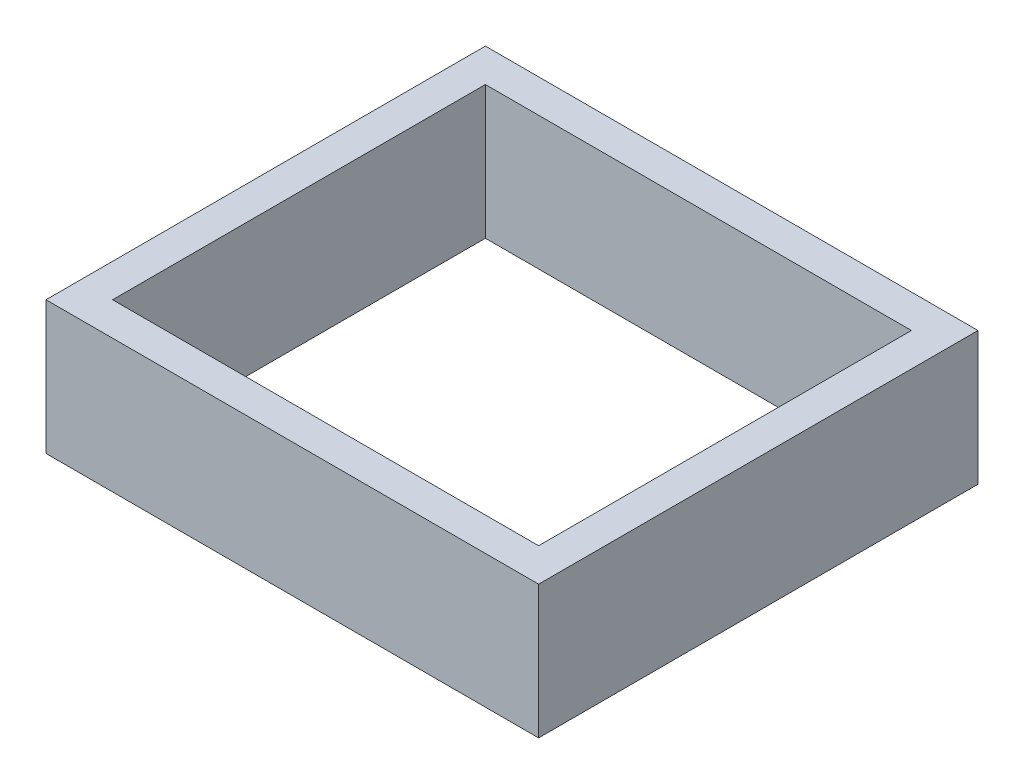
ISO-10303-21;
HEADER;
FILE_DESCRIPTION(('STEP AP214'),'2;1');
FILE_NAME('part.step','',(''),(''),'','','');
FILE_SCHEMA(('AUTOMOTIVE_DESIGN { 1 0 10303 214 1 1 1 1 }'));
ENDSEC;
DATA;
#1=APPLICATION_CONTEXT('core data for automotive mechanical design processes');
#2=APPLICATION_PROTOCOL_DEFINITION('international standard','automotive_design',2000,#1);
#3=PRODUCT_CONTEXT('',#1,'mechanical');
#4=PRODUCT('Part','Part','',(#3));
#5=PRODUCT_RELATED_PRODUCT_CATEGORY('part','',(#4));
#6=PRODUCT_DEFINITION_FORMATION('','',#4);
#7=PRODUCT_DEFINITION_CONTEXT('part definition',#1,'design');
#8=PRODUCT_DEFINITION('design','',#6,#7);
#9=PRODUCT_DEFINITION_SHAPE('','',#8);
#10=(LENGTH_UNIT() NAMED_UNIT(*) SI_UNIT(.MILLI.,.METRE.));
#11=(NAMED_UNIT(*) PLANE_ANGLE_UNIT() SI_UNIT($,.RADIAN.));
#12=(NAMED_UNIT(*) SI_UNIT($,.STERADIAN.) SOLID_ANGLE_UNIT());
#13=UNCERTAINTY_MEASURE_WITH_UNIT(LENGTH_MEASURE(1.E-05),#10,'distance_accuracy_value','');
#14=(GEOMETRIC_REPRESENTATION_CONTEXT(3) GLOBAL_UNCERTAINTY_ASSIGNED_CONTEXT((#13)) GLOBAL_UNIT_ASSIGNED_CONTEXT((#10,
#11,#12)) REPRESENTATION_CONTEXT('',''));
#15=CARTESIAN_POINT('',(0.,0.,0.));
#16=DIRECTION('',(0.,0.,1.));
#17=DIRECTION('',(1.,0.,0.));
#18=AXIS2_PLACEMENT_3D('',#15,#16,#17);
#19=CARTESIAN_POINT('',(0.,20.,0.));
#20=DIRECTION('',(0.,-1.,0.));
#21=DIRECTION('',(0.,0.,-1.));
#22=AXIS2_PLACEMENT_3D('',#19,#20,#21);
#23=PLANE('',#22);
#24=DIRECTION('',(0.,0.,1.));
#25=VECTOR('',#24,1.);
#26=CARTESIAN_POINT('',(0.,20.,0.));
#27=LINE('',#26,#25);
#28=CARTESIAN_POINT('',(0.,20.,-66.));
#29=VERTEX_POINT('',#28);
#30=CARTESIAN_POINT('',(0.,20.,0.));
#31=VERTEX_POINT('',#30);
#32=EDGE_CURVE('E134',#29,#31,#27,.T.);
#33=ORIENTED_EDGE('',*,*,#32,.T.);
#34=DIRECTION('',(1.,0.,0.));
#35=VECTOR('',#34,1.);
#36=CARTESIAN_POINT('',(0.,20.,0.));
#37=LINE('',#36,#35);
#38=CARTESIAN_POINT('',(74.,20.,0.));
#39=VERTEX_POINT('',#38);
#40=EDGE_CURVE('E137',#31,#39,#37,.T.);
#41=ORIENTED_EDGE('',*,*,#40,.T.);
#42=DIRECTION('',(0.,0.,-1.));
#43=VECTOR('',#42,1.);
#44=CARTESIAN_POINT('',(74.,20.,0.));
#45=LINE('',#44,#43);
#46=CARTESIAN_POINT('',(74.,20.,-66.));
#47=VERTEX_POINT('',#46);
#48=EDGE_CURVE('E140',#39,#47,#45,.T.);
#49=ORIENTED_EDGE('',*,*,#48,.T.);
#50=DIRECTION('',(-1.,0.,0.));
#51=VECTOR('',#50,1.);
#52=CARTESIAN_POINT('',(0.,20.,-66.));
#53=LINE('',#52,#51);
#54=EDGE_CURVE('E142',#47,#29,#53,.T.);
#55=ORIENTED_EDGE('',*,*,#54,.T.);
#56=EDGE_LOOP('',(#33,#41,#49,#55));
#57=FACE_BOUND('',#56,.T.);
#58=DIRECTION('',(0.,0.,1.));
#59=VECTOR('',#58,1.);
#60=CARTESIAN_POINT('',(5.,20.,-5.));
#61=LINE('',#60,#59);
#62=CARTESIAN_POINT('',(5.,20.,-61.));
#63=VERTEX_POINT('',#62);
#64=CARTESIAN_POINT('',(5.,20.,-5.));
#65=VERTEX_POINT('',#64);
#66=EDGE_CURVE('E98',#63,#65,#61,.T.);
#67=ORIENTED_EDGE('',*,*,#66,.F.);
#68=DIRECTION('',(-1.,0.,0.));
#69=VECTOR('',#68,1.);
#70=CARTESIAN_POINT('',(5.,20.,-61.));
#71=LINE('',#70,#69);
#72=CARTESIAN_POINT('',(69.,20.,-61.));
#73=VERTEX_POINT('',#72);
#74=EDGE_CURVE('E120',#73,#63,#71,.T.);
#75=ORIENTED_EDGE('',*,*,#74,.F.);
#76=DIRECTION('',(0.,0.,-1.));
#77=VECTOR('',#76,1.);
#78=CARTESIAN_POINT('',(69.,20.,-5.));
#79=LINE('',#78,#77);
#80=CARTESIAN_POINT('',(69.,20.,-5.));
#81=VERTEX_POINT('',#80);
#82=EDGE_CURVE('E118',#81,#73,#79,.T.);
#83=ORIENTED_EDGE('',*,*,#82,.F.);
#84=DIRECTION('',(1.,0.,0.));
#85=VECTOR('',#84,1.);
#86=CARTESIAN_POINT('',(5.,20.,-5.));
#87=LINE('',#86,#85);
#88=EDGE_CURVE('E106',#65,#81,#87,.T.);
#89=ORIENTED_EDGE('',*,*,#88,.F.);
#90=EDGE_LOOP('',(#67,#75,#83,#89));
#91=FACE_BOUND('',#90,.T.);
#92=ADVANCED_FACE('F33',(#57,#91),#23,.F.);
#93=CARTESIAN_POINT('',(0.,0.,0.));
#94=DIRECTION('',(0.,-1.,0.));
#95=DIRECTION('',(0.,0.,-1.));
#96=AXIS2_PLACEMENT_3D('',#93,#94,#95);
#97=PLANE('',#96);
#98=DIRECTION('',(0.,0.,1.));
#99=VECTOR('',#98,1.);
#100=CARTESIAN_POINT('',(0.,0.,0.));
#101=LINE('',#100,#99);
#102=CARTESIAN_POINT('',(0.,0.,-66.));
#103=VERTEX_POINT('',#102);
#104=CARTESIAN_POINT('',(0.,0.,0.));
#105=VERTEX_POINT('',#104);
#106=EDGE_CURVE('E114',#103,#105,#101,.T.);
#107=ORIENTED_EDGE('',*,*,#106,.F.);
#108=DIRECTION('',(-1.,0.,0.));
#109=VECTOR('',#108,1.);
#110=CARTESIAN_POINT('',(0.,0.,-66.));
#111=LINE('',#110,#109);
#112=CARTESIAN_POINT('',(74.,0.,-66.));
#113=VERTEX_POINT('',#112);
#114=EDGE_CURVE('E138',#113,#103,#111,.T.);
#115=ORIENTED_EDGE('',*,*,#114,.F.);
#116=DIRECTION('',(0.,0.,-1.));
#117=VECTOR('',#116,1.);
#118=CARTESIAN_POINT('',(74.,0.,0.));
#119=LINE('',#118,#117);
#120=CARTESIAN_POINT('',(74.,0.,0.));
#121=VERTEX_POINT('',#120);
#122=EDGE_CURVE('E149',#121,#113,#119,.T.);
#123=ORIENTED_EDGE('',*,*,#122,.F.);
#124=DIRECTION('',(1.,0.,0.));
#125=VECTOR('',#124,1.);
#126=CARTESIAN_POINT('',(0.,0.,0.));
#127=LINE('',#126,#125);
#128=EDGE_CURVE('E147',#105,#121,#127,.T.);
#129=ORIENTED_EDGE('',*,*,#128,.F.);
#130=EDGE_LOOP('',(#107,#115,#123,#129));
#131=FACE_BOUND('',#130,.T.);
#132=DIRECTION('',(-1.,0.,0.));
#133=VECTOR('',#132,1.);
#134=CARTESIAN_POINT('',(5.,0.,-61.));
#135=LINE('',#134,#133);
#136=CARTESIAN_POINT('',(69.,0.,-61.));
#137=VERTEX_POINT('',#136);
#138=CARTESIAN_POINT('',(5.,0.,-61.));
#139=VERTEX_POINT('',#138);
#140=EDGE_CURVE('E107',#137,#139,#135,.T.);
#141=ORIENTED_EDGE('',*,*,#140,.T.);
#142=DIRECTION('',(0.,0.,1.));
#143=VECTOR('',#142,1.);
#144=CARTESIAN_POINT('',(5.,0.,-5.));
#145=LINE('',#144,#143);
#146=CARTESIAN_POINT('',(5.,0.,-5.));
#147=VERTEX_POINT('',#146);
#148=EDGE_CURVE('E56',#139,#147,#145,.T.);
#149=ORIENTED_EDGE('',*,*,#148,.T.);
#150=DIRECTION('',(1.,0.,0.));
#151=VECTOR('',#150,1.);
#152=CARTESIAN_POINT('',(5.,0.,-5.));
#153=LINE('',#152,#151);
#154=CARTESIAN_POINT('',(69.,0.,-5.));
#155=VERTEX_POINT('',#154);
#156=EDGE_CURVE('E113',#147,#155,#153,.T.);
#157=ORIENTED_EDGE('',*,*,#156,.T.);
#158=DIRECTION('',(0.,0.,-1.));
#159=VECTOR('',#158,1.);
#160=CARTESIAN_POINT('',(69.,0.,-5.));
#161=LINE('',#160,#159);
#162=EDGE_CURVE('E126',#155,#137,#161,.T.);
#163=ORIENTED_EDGE('',*,*,#162,.T.);
#164=EDGE_LOOP('',(#141,#149,#157,#163));
#165=FACE_BOUND('',#164,.T.);
#166=ADVANCED_FACE('F167',(#131,#165),#97,.T.);
#167=CARTESIAN_POINT('',(0.,20.,0.));
#168=DIRECTION('',(1.,0.,0.));
#169=DIRECTION('',(0.,0.,-1.));
#170=AXIS2_PLACEMENT_3D('',#167,#168,#169);
#171=PLANE('',#170);
#172=ORIENTED_EDGE('',*,*,#106,.T.);
#173=DIRECTION('',(0.,-1.,0.));
#174=VECTOR('',#173,1.);
#175=CARTESIAN_POINT('',(0.,20.,0.));
#176=LINE('',#175,#174);
#177=EDGE_CURVE('E11',#31,#105,#176,.T.);
#178=ORIENTED_EDGE('',*,*,#177,.F.);
#179=ORIENTED_EDGE('',*,*,#32,.F.);
#180=DIRECTION('',(0.,-1.,0.));
#181=VECTOR('',#180,1.);
#182=CARTESIAN_POINT('',(0.,20.,-66.));
#183=LINE('',#182,#181);
#184=EDGE_CURVE('E144',#29,#103,#183,.T.);
#185=ORIENTED_EDGE('',*,*,#184,.T.);
#186=EDGE_LOOP('',(#172,#178,#179,#185));
#187=FACE_BOUND('',#186,.T.);
#188=ADVANCED_FACE('F35',(#187),#171,.F.);
#189=CARTESIAN_POINT('',(0.,20.,0.));
#190=DIRECTION('',(0.,0.,-1.));
#191=DIRECTION('',(-1.,0.,0.));
#192=AXIS2_PLACEMENT_3D('',#189,#190,#191);
#193=PLANE('',#192);
#194=ORIENTED_EDGE('',*,*,#128,.T.);
#195=DIRECTION('',(0.,-1.,0.));
#196=VECTOR('',#195,1.);
#197=CARTESIAN_POINT('',(74.,20.,0.));
#198=LINE('',#197,#196);
#199=EDGE_CURVE('E41',#39,#121,#198,.T.);
#200=ORIENTED_EDGE('',*,*,#199,.F.);
#201=ORIENTED_EDGE('',*,*,#40,.F.);
#202=ORIENTED_EDGE('',*,*,#177,.T.);
#203=EDGE_LOOP('',(#194,#200,#201,#202));
#204=FACE_BOUND('',#203,.T.);
#205=ADVANCED_FACE('F177',(#204),#193,.F.);
#206=CARTESIAN_POINT('',(74.,20.,0.));
#207=DIRECTION('',(-1.,0.,0.));
#208=DIRECTION('',(0.,0.,1.));
#209=AXIS2_PLACEMENT_3D('',#206,#207,#208);
#210=PLANE('',#209);
#211=ORIENTED_EDGE('',*,*,#122,.T.);
#212=DIRECTION('',(0.,-1.,0.));
#213=VECTOR('',#212,1.);
#214=CARTESIAN_POINT('',(74.,20.,-66.));
#215=LINE('',#214,#213);
#216=EDGE_CURVE('E154',#47,#113,#215,.T.);
#217=ORIENTED_EDGE('',*,*,#216,.F.);
#218=ORIENTED_EDGE('',*,*,#48,.F.);
#219=ORIENTED_EDGE('',*,*,#199,.T.);
#220=EDGE_LOOP('',(#211,#217,#218,#219));
#221=FACE_BOUND('',#220,.T.);
#222=ADVANCED_FACE('F161',(#221),#210,.F.);
#223=CARTESIAN_POINT('',(0.,20.,-66.));
#224=DIRECTION('',(0.,0.,1.));
#225=DIRECTION('',(1.,0.,0.));
#226=AXIS2_PLACEMENT_3D('',#223,#224,#225);
#227=PLANE('',#226);
#228=ORIENTED_EDGE('',*,*,#114,.T.);
#229=ORIENTED_EDGE('',*,*,#184,.F.);
#230=ORIENTED_EDGE('',*,*,#54,.F.);
#231=ORIENTED_EDGE('',*,*,#216,.T.);
#232=EDGE_LOOP('',(#228,#229,#230,#231));
#233=FACE_BOUND('',#232,.T.);
#234=ADVANCED_FACE('F171',(#233),#227,.F.);
#235=CARTESIAN_POINT('',(5.,20.,-5.));
#236=DIRECTION('',(1.,0.,0.));
#237=DIRECTION('',(0.,0.,-1.));
#238=AXIS2_PLACEMENT_3D('',#235,#236,#237);
#239=PLANE('',#238);
#240=ORIENTED_EDGE('',*,*,#148,.F.);
#241=DIRECTION('',(0.,-1.,0.));
#242=VECTOR('',#241,1.);
#243=CARTESIAN_POINT('',(5.,20.,-61.));
#244=LINE('',#243,#242);
#245=EDGE_CURVE('E102',#63,#139,#244,.T.);
#246=ORIENTED_EDGE('',*,*,#245,.F.);
#247=ORIENTED_EDGE('',*,*,#66,.T.);
#248=DIRECTION('',(0.,-1.,0.));
#249=VECTOR('',#248,1.);
#250=CARTESIAN_POINT('',(5.,20.,-5.));
#251=LINE('',#250,#249);
#252=EDGE_CURVE('E101',#65,#147,#251,.T.);
#253=ORIENTED_EDGE('',*,*,#252,.T.);
#254=EDGE_LOOP('',(#240,#246,#247,#253));
#255=FACE_BOUND('',#254,.T.);
#256=ADVANCED_FACE('F100',(#255),#239,.T.);
#257=CARTESIAN_POINT('',(5.,20.,-5.));
#258=DIRECTION('',(0.,0.,-1.));
#259=DIRECTION('',(-1.,0.,0.));
#260=AXIS2_PLACEMENT_3D('',#257,#258,#259);
#261=PLANE('',#260);
#262=ORIENTED_EDGE('',*,*,#156,.F.);
#263=ORIENTED_EDGE('',*,*,#252,.F.);
#264=ORIENTED_EDGE('',*,*,#88,.T.);
#265=DIRECTION('',(0.,-1.,0.));
#266=VECTOR('',#265,1.);
#267=CARTESIAN_POINT('',(69.,20.,-5.));
#268=LINE('',#267,#266);
#269=EDGE_CURVE('E115',#81,#155,#268,.T.);
#270=ORIENTED_EDGE('',*,*,#269,.T.);
#271=EDGE_LOOP('',(#262,#263,#264,#270));
#272=FACE_BOUND('',#271,.T.);
#273=ADVANCED_FACE('F110',(#272),#261,.T.);
#274=CARTESIAN_POINT('',(69.,20.,-5.));
#275=DIRECTION('',(-1.,0.,0.));
#276=DIRECTION('',(0.,0.,1.));
#277=AXIS2_PLACEMENT_3D('',#274,#275,#276);
#278=PLANE('',#277);
#279=ORIENTED_EDGE('',*,*,#162,.F.);
#280=ORIENTED_EDGE('',*,*,#269,.F.);
#281=ORIENTED_EDGE('',*,*,#82,.T.);
#282=DIRECTION('',(0.,-1.,0.));
#283=VECTOR('',#282,1.);
#284=CARTESIAN_POINT('',(69.,20.,-61.));
#285=LINE('',#284,#283);
#286=EDGE_CURVE('E48',#73,#137,#285,.T.);
#287=ORIENTED_EDGE('',*,*,#286,.T.);
#288=EDGE_LOOP('',(#279,#280,#281,#287));
#289=FACE_BOUND('',#288,.T.);
#290=ADVANCED_FACE('F200',(#289),#278,.T.);
#291=CARTESIAN_POINT('',(5.,20.,-61.));
#292=DIRECTION('',(0.,0.,1.));
#293=DIRECTION('',(1.,0.,0.));
#294=AXIS2_PLACEMENT_3D('',#291,#292,#293);
#295=PLANE('',#294);
#296=ORIENTED_EDGE('',*,*,#140,.F.);
#297=ORIENTED_EDGE('',*,*,#286,.F.);
#298=ORIENTED_EDGE('',*,*,#74,.T.);
#299=ORIENTED_EDGE('',*,*,#245,.T.);
#300=EDGE_LOOP('',(#296,#297,#298,#299));
#301=FACE_BOUND('',#300,.T.);
#302=ADVANCED_FACE('F204',(#301),#295,.T.);
#303=CLOSED_SHELL('',(#92,#166,#188,#205,#222,#234,#256,#273,#290,#302));
#304=MANIFOLD_SOLID_BREP('B2',#303);
#305=ADVANCED_BREP_SHAPE_REPRESENTATION('',(#18,#304),#14);
#306=SHAPE_DEFINITION_REPRESENTATION(#9,#305);
ENDSEC;
END-ISO-10303-21;
